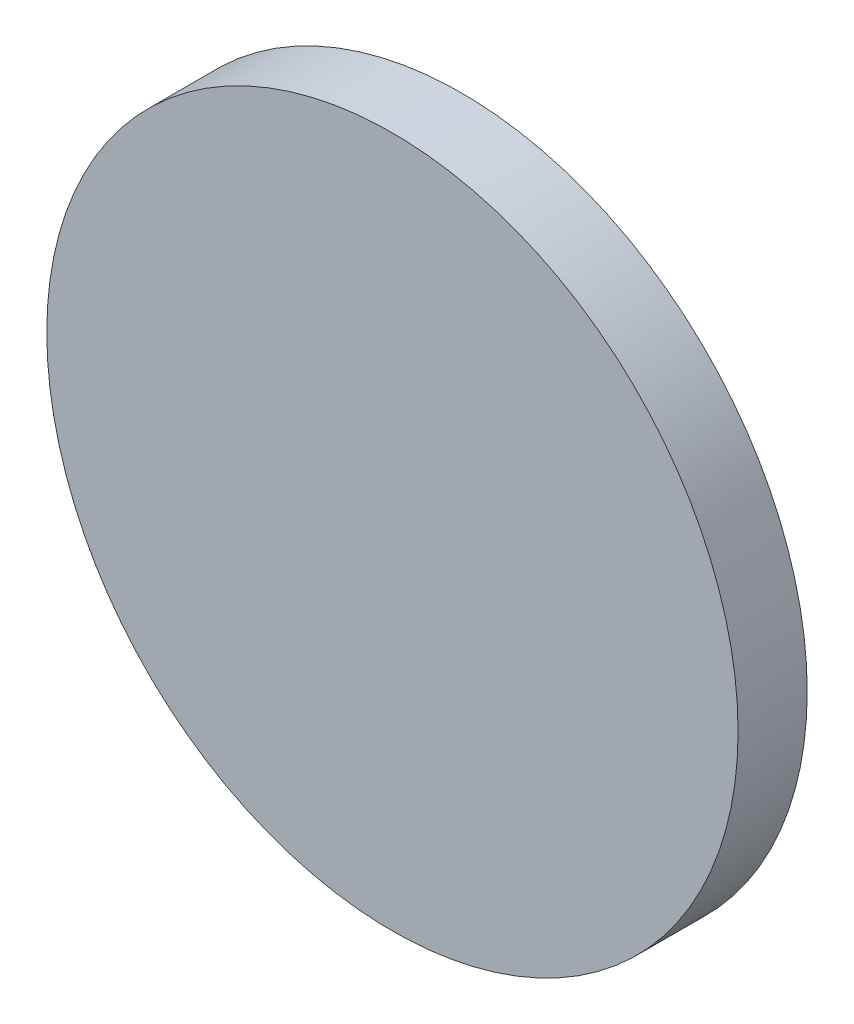
ISO-10303-21;
HEADER;
FILE_DESCRIPTION(('STEP AP214'),'2;1');
FILE_NAME('part.step','',(''),(''),'','','');
FILE_SCHEMA(('AUTOMOTIVE_DESIGN { 1 0 10303 214 1 1 1 1 }'));
ENDSEC;
DATA;
#1=APPLICATION_CONTEXT('core data for automotive mechanical design processes');
#2=APPLICATION_PROTOCOL_DEFINITION('international standard','automotive_design',2000,#1);
#3=PRODUCT_CONTEXT('',#1,'mechanical');
#4=PRODUCT('Part','Part','',(#3));
#5=PRODUCT_RELATED_PRODUCT_CATEGORY('part','',(#4));
#6=PRODUCT_DEFINITION_FORMATION('','',#4);
#7=PRODUCT_DEFINITION_CONTEXT('part definition',#1,'design');
#8=PRODUCT_DEFINITION('design','',#6,#7);
#9=PRODUCT_DEFINITION_SHAPE('','',#8);
#10=(LENGTH_UNIT() NAMED_UNIT(*) SI_UNIT(.MILLI.,.METRE.));
#11=(NAMED_UNIT(*) PLANE_ANGLE_UNIT() SI_UNIT($,.RADIAN.));
#12=(NAMED_UNIT(*) SI_UNIT($,.STERADIAN.) SOLID_ANGLE_UNIT());
#13=UNCERTAINTY_MEASURE_WITH_UNIT(LENGTH_MEASURE(1.E-05),#10,'distance_accuracy_value','');
#14=(GEOMETRIC_REPRESENTATION_CONTEXT(3) GLOBAL_UNCERTAINTY_ASSIGNED_CONTEXT((#13)) GLOBAL_UNIT_ASSIGNED_CONTEXT((#10,
#11,#12)) REPRESENTATION_CONTEXT('',''));
#15=CARTESIAN_POINT('',(0.,0.,0.));
#16=DIRECTION('',(0.,0.,1.));
#17=DIRECTION('',(1.,0.,0.));
#18=AXIS2_PLACEMENT_3D('',#15,#16,#17);
#19=CARTESIAN_POINT('',(0.,179.95,-10.));
#20=DIRECTION('',(0.,0.,1.));
#21=DIRECTION('',(1.,0.,0.));
#22=AXIS2_PLACEMENT_3D('',#19,#20,#21);
#23=CYLINDRICAL_SURFACE('',#22,50.);
#24=CARTESIAN_POINT('',(0.,179.95,-10.));
#25=DIRECTION('',(0.,0.,1.));
#26=DIRECTION('',(1.,0.,0.));
#27=AXIS2_PLACEMENT_3D('',#24,#25,#26);
#28=CIRCLE('',#27,50.);
#29=CARTESIAN_POINT('',(50.,179.95,-10.));
#30=VERTEX_POINT('',#29);
#31=EDGE_CURVE('E10',#30,#30,#28,.T.);
#32=ORIENTED_EDGE('',*,*,#31,.T.);
#33=EDGE_LOOP('',(#32));
#34=FACE_BOUND('',#33,.T.);
#35=CARTESIAN_POINT('',(0.,179.95,0.));
#36=DIRECTION('',(0.,0.,1.));
#37=DIRECTION('',(1.,0.,0.));
#38=AXIS2_PLACEMENT_3D('',#35,#36,#37);
#39=CIRCLE('',#38,50.);
#40=CARTESIAN_POINT('',(50.,179.95,0.));
#41=VERTEX_POINT('',#40);
#42=EDGE_CURVE('E42',#41,#41,#39,.T.);
#43=ORIENTED_EDGE('',*,*,#42,.F.);
#44=EDGE_LOOP('',(#43));
#45=FACE_BOUND('',#44,.T.);
#46=ADVANCED_FACE('F39',(#34,#45),#23,.T.);
#47=CARTESIAN_POINT('',(0.,179.95,-10.));
#48=DIRECTION('',(0.,0.,1.));
#49=DIRECTION('',(1.,0.,0.));
#50=AXIS2_PLACEMENT_3D('',#47,#48,#49);
#51=PLANE('',#50);
#52=ORIENTED_EDGE('',*,*,#31,.F.);
#53=EDGE_LOOP('',(#52));
#54=FACE_BOUND('',#53,.T.);
#55=ADVANCED_FACE('F54',(#54),#51,.F.);
#56=CARTESIAN_POINT('',(0.,179.95,0.));
#57=DIRECTION('',(0.,0.,1.));
#58=DIRECTION('',(1.,0.,0.));
#59=AXIS2_PLACEMENT_3D('',#56,#57,#58);
#60=PLANE('',#59);
#61=ORIENTED_EDGE('',*,*,#42,.T.);
#62=EDGE_LOOP('',(#61));
#63=FACE_BOUND('',#62,.T.);
#64=ADVANCED_FACE('F51',(#63),#60,.T.);
#65=CLOSED_SHELL('',(#46,#55,#64));
#66=MANIFOLD_SOLID_BREP('B2',#65);
#67=ADVANCED_BREP_SHAPE_REPRESENTATION('',(#18,#66),#14);
#68=SHAPE_DEFINITION_REPRESENTATION(#9,#67);
ENDSEC;
END-ISO-10303-21;
